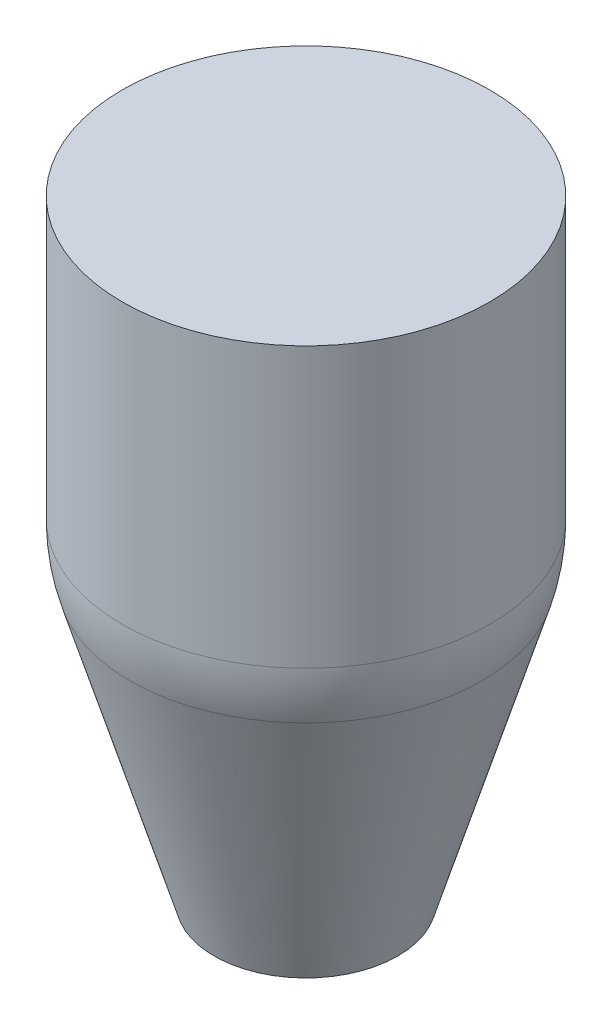
ISO-10303-21;
HEADER;
FILE_DESCRIPTION(('STEP AP214'),'2;1');
FILE_NAME('part.step','',(''),(''),'','','');
FILE_SCHEMA(('AUTOMOTIVE_DESIGN { 1 0 10303 214 1 1 1 1 }'));
ENDSEC;
DATA;
#1=APPLICATION_CONTEXT('core data for automotive mechanical design processes');
#2=APPLICATION_PROTOCOL_DEFINITION('international standard','automotive_design',2000,#1);
#3=PRODUCT_CONTEXT('',#1,'mechanical');
#4=PRODUCT('Part','Part','',(#3));
#5=PRODUCT_RELATED_PRODUCT_CATEGORY('part','',(#4));
#6=PRODUCT_DEFINITION_FORMATION('','',#4);
#7=PRODUCT_DEFINITION_CONTEXT('part definition',#1,'design');
#8=PRODUCT_DEFINITION('design','',#6,#7);
#9=PRODUCT_DEFINITION_SHAPE('','',#8);
#10=(LENGTH_UNIT() NAMED_UNIT(*) SI_UNIT(.MILLI.,.METRE.));
#11=(NAMED_UNIT(*) PLANE_ANGLE_UNIT() SI_UNIT($,.RADIAN.));
#12=(NAMED_UNIT(*) SI_UNIT($,.STERADIAN.) SOLID_ANGLE_UNIT());
#13=UNCERTAINTY_MEASURE_WITH_UNIT(LENGTH_MEASURE(1.E-05),#10,'distance_accuracy_value','');
#14=(GEOMETRIC_REPRESENTATION_CONTEXT(3) GLOBAL_UNCERTAINTY_ASSIGNED_CONTEXT((#13)) GLOBAL_UNIT_ASSIGNED_CONTEXT((#10,
#11,#12)) REPRESENTATION_CONTEXT('',''));
#15=CARTESIAN_POINT('',(0.,0.,0.));
#16=DIRECTION('',(0.,0.,1.));
#17=DIRECTION('',(1.,0.,0.));
#18=AXIS2_PLACEMENT_3D('',#15,#16,#17);
#19=CARTESIAN_POINT('',(30.,100.,0.));
#20=DIRECTION('',(0.,-1.,0.));
#21=DIRECTION('',(1.,0.,0.));
#22=AXIS2_PLACEMENT_3D('',#19,#20,#21);
#23=PLANE('',#22);
#24=CARTESIAN_POINT('',(0.,100.,0.));
#25=DIRECTION('',(0.,1.,0.));
#26=DIRECTION('',(-1.,0.,0.));
#27=AXIS2_PLACEMENT_3D('',#24,#25,#26);
#28=CIRCLE('',#27,30.);
#29=CARTESIAN_POINT('',(-30.,100.,0.));
#30=VERTEX_POINT('',#29);
#31=EDGE_CURVE('E54',#30,#30,#28,.T.);
#32=ORIENTED_EDGE('',*,*,#31,.T.);
#33=EDGE_LOOP('',(#32));
#34=FACE_BOUND('',#33,.T.);
#35=ADVANCED_FACE('F37',(#34),#23,.F.);
#36=CARTESIAN_POINT('',(0.,0.,0.));
#37=DIRECTION('',(0.,1.,0.));
#38=DIRECTION('',(-1.,0.,0.));
#39=AXIS2_PLACEMENT_3D('',#36,#37,#38);
#40=PLANE('',#39);
#41=CARTESIAN_POINT('',(0.,0.,0.));
#42=DIRECTION('',(0.,1.,0.));
#43=DIRECTION('',(-1.,0.,0.));
#44=AXIS2_PLACEMENT_3D('',#41,#42,#43);
#45=CIRCLE('',#44,15.);
#46=CARTESIAN_POINT('',(-15.,0.,0.));
#47=VERTEX_POINT('',#46);
#48=EDGE_CURVE('E10',#47,#47,#45,.T.);
#49=ORIENTED_EDGE('',*,*,#48,.F.);
#50=EDGE_LOOP('',(#49));
#51=FACE_BOUND('',#50,.T.);
#52=ADVANCED_FACE('F75',(#51),#40,.F.);
#53=CARTESIAN_POINT('',(0.,0.,0.));
#54=DIRECTION('',(0.,1.,0.));
#55=DIRECTION('',(-1.,0.,0.));
#56=AXIS2_PLACEMENT_3D('',#53,#54,#55);
#57=CONICAL_SURFACE('',#56,15.,0.291456794477867);
#58=CARTESIAN_POINT('',(0.,45.782628522115,0.));
#59=DIRECTION('',(0.,1.,0.));
#60=DIRECTION('',(-1.,0.,0.));
#61=AXIS2_PLACEMENT_3D('',#58,#59,#60);
#62=CIRCLE('',#61,28.7347885566345);
#63=CARTESIAN_POINT('',(-28.7347885566345,45.782628522115,0.));
#64=VERTEX_POINT('',#63);
#65=EDGE_CURVE('E44',#64,#64,#62,.T.);
#66=ORIENTED_EDGE('',*,*,#65,.F.);
#67=EDGE_LOOP('',(#66));
#68=FACE_BOUND('',#67,.T.);
#69=ORIENTED_EDGE('',*,*,#48,.T.);
#70=EDGE_LOOP('',(#69));
#71=FACE_BOUND('',#70,.T.);
#72=ADVANCED_FACE('F70',(#68,#71),#57,.T.);
#73=CARTESIAN_POINT('',(0.,54.4030650891055,0.));
#74=DIRECTION('',(0.,1.,0.));
#75=DIRECTION('',(1.,0.,0.));
#76=AXIS2_PLACEMENT_3D('',#73,#74,#75);
#77=SPHERICAL_SURFACE('',#76,30.);
#78=CARTESIAN_POINT('',(0.,54.4030650891055,0.));
#79=DIRECTION('',(0.,1.,0.));
#80=DIRECTION('',(-1.,0.,0.));
#81=AXIS2_PLACEMENT_3D('',#78,#79,#80);
#82=CIRCLE('',#81,30.);
#83=CARTESIAN_POINT('',(-30.,54.4030650891055,0.));
#84=VERTEX_POINT('',#83);
#85=EDGE_CURVE('E49',#84,#84,#82,.T.);
#86=ORIENTED_EDGE('',*,*,#85,.F.);
#87=EDGE_LOOP('',(#86));
#88=FACE_BOUND('',#87,.T.);
#89=ORIENTED_EDGE('',*,*,#65,.T.);
#90=EDGE_LOOP('',(#89));
#91=FACE_BOUND('',#90,.T.);
#92=ADVANCED_FACE('F65',(#88,#91),#77,.T.);
#93=CARTESIAN_POINT('',(0.,100.,0.));
#94=DIRECTION('',(0.,1.,0.));
#95=DIRECTION('',(-1.,0.,0.));
#96=AXIS2_PLACEMENT_3D('',#93,#94,#95);
#97=CYLINDRICAL_SURFACE('',#96,30.);
#98=ORIENTED_EDGE('',*,*,#31,.F.);
#99=EDGE_LOOP('',(#98));
#100=FACE_BOUND('',#99,.T.);
#101=ORIENTED_EDGE('',*,*,#85,.T.);
#102=EDGE_LOOP('',(#101));
#103=FACE_BOUND('',#102,.T.);
#104=ADVANCED_FACE('F62',(#100,#103),#97,.T.);
#105=CLOSED_SHELL('',(#35,#52,#72,#92,#104));
#106=MANIFOLD_SOLID_BREP('B2',#105);
#107=ADVANCED_BREP_SHAPE_REPRESENTATION('',(#18,#106),#14);
#108=SHAPE_DEFINITION_REPRESENTATION(#9,#107);
ENDSEC;
END-ISO-10303-21;
